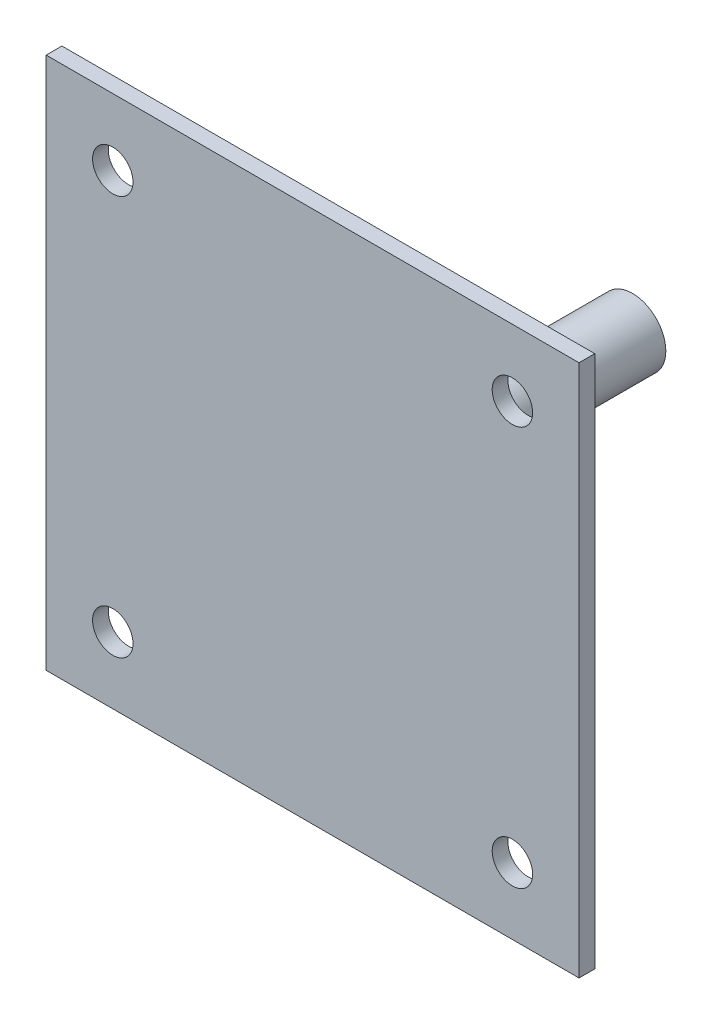
ISO-10303-21;
HEADER;
FILE_DESCRIPTION(('STEP AP214'),'2;1');
FILE_NAME('part.step','',(''),(''),'','','');
FILE_SCHEMA(('AUTOMOTIVE_DESIGN { 1 0 10303 214 1 1 1 1 }'));
ENDSEC;
DATA;
#1=APPLICATION_CONTEXT('core data for automotive mechanical design processes');
#2=APPLICATION_PROTOCOL_DEFINITION('international standard','automotive_design',2000,#1);
#3=PRODUCT_CONTEXT('',#1,'mechanical');
#4=PRODUCT('Part','Part','',(#3));
#5=PRODUCT_RELATED_PRODUCT_CATEGORY('part','',(#4));
#6=PRODUCT_DEFINITION_FORMATION('','',#4);
#7=PRODUCT_DEFINITION_CONTEXT('part definition',#1,'design');
#8=PRODUCT_DEFINITION('design','',#6,#7);
#9=PRODUCT_DEFINITION_SHAPE('','',#8);
#10=(LENGTH_UNIT() NAMED_UNIT(*) SI_UNIT(.MILLI.,.METRE.));
#11=(NAMED_UNIT(*) PLANE_ANGLE_UNIT() SI_UNIT($,.RADIAN.));
#12=(NAMED_UNIT(*) SI_UNIT($,.STERADIAN.) SOLID_ANGLE_UNIT());
#13=UNCERTAINTY_MEASURE_WITH_UNIT(LENGTH_MEASURE(1.E-05),#10,'distance_accuracy_value','');
#14=(GEOMETRIC_REPRESENTATION_CONTEXT(3) GLOBAL_UNCERTAINTY_ASSIGNED_CONTEXT((#13)) GLOBAL_UNIT_ASSIGNED_CONTEXT((#10,
#11,#12)) REPRESENTATION_CONTEXT('',''));
#15=CARTESIAN_POINT('',(0.,0.,0.));
#16=DIRECTION('',(0.,0.,1.));
#17=DIRECTION('',(1.,0.,0.));
#18=AXIS2_PLACEMENT_3D('',#15,#16,#17);
#19=CARTESIAN_POINT('',(50.8,0.,3.));
#20=DIRECTION('',(1.,0.,0.));
#21=DIRECTION('',(0.,0.,-1.));
#22=AXIS2_PLACEMENT_3D('',#19,#20,#21);
#23=PLANE('',#22);
#24=DIRECTION('',(0.,-1.,0.));
#25=VECTOR('',#24,1.);
#26=CARTESIAN_POINT('',(50.8,0.,0.));
#27=LINE('',#26,#25);
#28=CARTESIAN_POINT('',(50.8,50.8,0.));
#29=VERTEX_POINT('',#28);
#30=CARTESIAN_POINT('',(50.8,-50.8,0.));
#31=VERTEX_POINT('',#30);
#32=EDGE_CURVE('E137',#29,#31,#27,.T.);
#33=ORIENTED_EDGE('',*,*,#32,.F.);
#34=DIRECTION('',(0.,0.,-1.));
#35=VECTOR('',#34,1.);
#36=CARTESIAN_POINT('',(50.8,50.8,3.));
#37=LINE('',#36,#35);
#38=CARTESIAN_POINT('',(50.8,50.8,3.));
#39=VERTEX_POINT('',#38);
#40=EDGE_CURVE('E11',#39,#29,#37,.T.);
#41=ORIENTED_EDGE('',*,*,#40,.F.);
#42=DIRECTION('',(0.,-1.,0.));
#43=VECTOR('',#42,1.);
#44=CARTESIAN_POINT('',(50.8,0.,3.));
#45=LINE('',#44,#43);
#46=CARTESIAN_POINT('',(50.8,-50.8,3.));
#47=VERTEX_POINT('',#46);
#48=EDGE_CURVE('E110',#39,#47,#45,.T.);
#49=ORIENTED_EDGE('',*,*,#48,.T.);
#50=DIRECTION('',(0.,0.,-1.));
#51=VECTOR('',#50,1.);
#52=CARTESIAN_POINT('',(50.8,-50.8,3.));
#53=LINE('',#52,#51);
#54=EDGE_CURVE('E86',#47,#31,#53,.T.);
#55=ORIENTED_EDGE('',*,*,#54,.T.);
#56=EDGE_LOOP('',(#33,#41,#49,#55));
#57=FACE_BOUND('',#56,.T.);
#58=ADVANCED_FACE('F45',(#57),#23,.T.);
#59=CARTESIAN_POINT('',(0.,50.8,3.));
#60=DIRECTION('',(0.,1.,0.));
#61=DIRECTION('',(0.,0.,1.));
#62=AXIS2_PLACEMENT_3D('',#59,#60,#61);
#63=PLANE('',#62);
#64=DIRECTION('',(1.,0.,0.));
#65=VECTOR('',#64,1.);
#66=CARTESIAN_POINT('',(0.,50.8,0.));
#67=LINE('',#66,#65);
#68=CARTESIAN_POINT('',(-50.8,50.8,0.));
#69=VERTEX_POINT('',#68);
#70=EDGE_CURVE('E98',#69,#29,#67,.T.);
#71=ORIENTED_EDGE('',*,*,#70,.F.);
#72=DIRECTION('',(0.,0.,-1.));
#73=VECTOR('',#72,1.);
#74=CARTESIAN_POINT('',(-50.8,50.8,3.));
#75=LINE('',#74,#73);
#76=CARTESIAN_POINT('',(-50.8,50.8,3.));
#77=VERTEX_POINT('',#76);
#78=EDGE_CURVE('E55',#77,#69,#75,.T.);
#79=ORIENTED_EDGE('',*,*,#78,.F.);
#80=DIRECTION('',(1.,0.,0.));
#81=VECTOR('',#80,1.);
#82=CARTESIAN_POINT('',(0.,50.8,3.));
#83=LINE('',#82,#81);
#84=EDGE_CURVE('E96',#77,#39,#83,.T.);
#85=ORIENTED_EDGE('',*,*,#84,.T.);
#86=ORIENTED_EDGE('',*,*,#40,.T.);
#87=EDGE_LOOP('',(#71,#79,#85,#86));
#88=FACE_BOUND('',#87,.T.);
#89=ADVANCED_FACE('F94',(#88),#63,.T.);
#90=CARTESIAN_POINT('',(-50.8,0.,3.));
#91=DIRECTION('',(1.,0.,0.));
#92=DIRECTION('',(0.,0.,-1.));
#93=AXIS2_PLACEMENT_3D('',#90,#91,#92);
#94=PLANE('',#93);
#95=DIRECTION('',(0.,-1.,0.));
#96=VECTOR('',#95,1.);
#97=CARTESIAN_POINT('',(-50.8,0.,0.));
#98=LINE('',#97,#96);
#99=CARTESIAN_POINT('',(-50.8,-50.8,0.));
#100=VERTEX_POINT('',#99);
#101=EDGE_CURVE('E142',#69,#100,#98,.T.);
#102=ORIENTED_EDGE('',*,*,#101,.T.);
#103=DIRECTION('',(0.,0.,-1.));
#104=VECTOR('',#103,1.);
#105=CARTESIAN_POINT('',(-50.8,-50.8,3.));
#106=LINE('',#105,#104);
#107=CARTESIAN_POINT('',(-50.8,-50.8,3.));
#108=VERTEX_POINT('',#107);
#109=EDGE_CURVE('E102',#108,#100,#106,.T.);
#110=ORIENTED_EDGE('',*,*,#109,.F.);
#111=DIRECTION('',(0.,-1.,0.));
#112=VECTOR('',#111,1.);
#113=CARTESIAN_POINT('',(-50.8,0.,3.));
#114=LINE('',#113,#112);
#115=EDGE_CURVE('E104',#77,#108,#114,.T.);
#116=ORIENTED_EDGE('',*,*,#115,.F.);
#117=ORIENTED_EDGE('',*,*,#78,.T.);
#118=EDGE_LOOP('',(#102,#110,#116,#117));
#119=FACE_BOUND('',#118,.T.);
#120=ADVANCED_FACE('F105',(#119),#94,.F.);
#121=CARTESIAN_POINT('',(38.1,-38.1,3.));
#122=DIRECTION('',(0.,0.,-1.));
#123=DIRECTION('',(-1.,0.,0.));
#124=AXIS2_PLACEMENT_3D('',#121,#122,#123);
#125=CYLINDRICAL_SURFACE('',#124,3.85643376549096);
#126=CARTESIAN_POINT('',(38.1,-38.1,3.));
#127=DIRECTION('',(0.,0.,1.));
#128=DIRECTION('',(1.,0.,0.));
#129=AXIS2_PLACEMENT_3D('',#126,#127,#128);
#130=CIRCLE('',#129,3.85643376549096);
#131=CARTESIAN_POINT('',(41.9564337654909,-38.1,3.));
#132=VERTEX_POINT('',#131);
#133=EDGE_CURVE('E120',#132,#132,#130,.T.);
#134=ORIENTED_EDGE('',*,*,#133,.T.);
#135=EDGE_LOOP('',(#134));
#136=FACE_BOUND('',#135,.T.);
#137=CARTESIAN_POINT('',(38.1,-38.1,0.));
#138=DIRECTION('',(0.,0.,1.));
#139=DIRECTION('',(1.,0.,0.));
#140=AXIS2_PLACEMENT_3D('',#137,#138,#139);
#141=CIRCLE('',#140,3.85643376549096);
#142=CARTESIAN_POINT('',(41.9564337654909,-38.1,0.));
#143=VERTEX_POINT('',#142);
#144=EDGE_CURVE('E147',#143,#143,#141,.T.);
#145=ORIENTED_EDGE('',*,*,#144,.F.);
#146=EDGE_LOOP('',(#145));
#147=FACE_BOUND('',#146,.T.);
#148=ADVANCED_FACE('F179',(#136,#147),#125,.F.);
#149=CARTESIAN_POINT('',(0.,-50.8,3.));
#150=DIRECTION('',(0.,1.,0.));
#151=DIRECTION('',(0.,0.,1.));
#152=AXIS2_PLACEMENT_3D('',#149,#150,#151);
#153=PLANE('',#152);
#154=DIRECTION('',(1.,0.,0.));
#155=VECTOR('',#154,1.);
#156=CARTESIAN_POINT('',(0.,-50.8,0.));
#157=LINE('',#156,#155);
#158=EDGE_CURVE('E79',#100,#31,#157,.T.);
#159=ORIENTED_EDGE('',*,*,#158,.T.);
#160=ORIENTED_EDGE('',*,*,#54,.F.);
#161=DIRECTION('',(1.,0.,0.));
#162=VECTOR('',#161,1.);
#163=CARTESIAN_POINT('',(0.,-50.8,3.));
#164=LINE('',#163,#162);
#165=EDGE_CURVE('E63',#108,#47,#164,.T.);
#166=ORIENTED_EDGE('',*,*,#165,.F.);
#167=ORIENTED_EDGE('',*,*,#109,.T.);
#168=EDGE_LOOP('',(#159,#160,#166,#167));
#169=FACE_BOUND('',#168,.T.);
#170=ADVANCED_FACE('F160',(#169),#153,.F.);
#171=CARTESIAN_POINT('',(-38.1,38.1,3.));
#172=DIRECTION('',(0.,0.,-1.));
#173=DIRECTION('',(-1.,0.,0.));
#174=AXIS2_PLACEMENT_3D('',#171,#172,#173);
#175=CYLINDRICAL_SURFACE('',#174,3.85643376549096);
#176=CARTESIAN_POINT('',(-38.1,38.1,3.));
#177=DIRECTION('',(0.,0.,1.));
#178=DIRECTION('',(1.,0.,0.));
#179=AXIS2_PLACEMENT_3D('',#176,#177,#178);
#180=CIRCLE('',#179,3.85643376549096);
#181=CARTESIAN_POINT('',(-34.243566234509,38.1,3.));
#182=VERTEX_POINT('',#181);
#183=EDGE_CURVE('E114',#182,#182,#180,.T.);
#184=ORIENTED_EDGE('',*,*,#183,.T.);
#185=EDGE_LOOP('',(#184));
#186=FACE_BOUND('',#185,.T.);
#187=CARTESIAN_POINT('',(-38.1,38.1,0.));
#188=DIRECTION('',(0.,0.,1.));
#189=DIRECTION('',(1.,0.,0.));
#190=AXIS2_PLACEMENT_3D('',#187,#188,#189);
#191=CIRCLE('',#190,3.85643376549096);
#192=CARTESIAN_POINT('',(-34.243566234509,38.1,0.));
#193=VERTEX_POINT('',#192);
#194=EDGE_CURVE('E132',#193,#193,#191,.T.);
#195=ORIENTED_EDGE('',*,*,#194,.F.);
#196=EDGE_LOOP('',(#195));
#197=FACE_BOUND('',#196,.T.);
#198=ADVANCED_FACE('F170',(#186,#197),#175,.F.);
#199=CARTESIAN_POINT('',(38.1,38.1,3.));
#200=DIRECTION('',(0.,0.,-1.));
#201=DIRECTION('',(-1.,0.,0.));
#202=AXIS2_PLACEMENT_3D('',#199,#200,#201);
#203=CYLINDRICAL_SURFACE('',#202,3.85643376549096);
#204=CARTESIAN_POINT('',(38.1,38.1,3.));
#205=DIRECTION('',(0.,0.,1.));
#206=DIRECTION('',(1.,0.,0.));
#207=AXIS2_PLACEMENT_3D('',#204,#205,#206);
#208=CIRCLE('',#207,3.85643376549096);
#209=CARTESIAN_POINT('',(41.9564337654909,38.1,3.));
#210=VERTEX_POINT('',#209);
#211=EDGE_CURVE('E155',#210,#210,#208,.F.);
#212=ORIENTED_EDGE('',*,*,#211,.F.);
#213=EDGE_LOOP('',(#212));
#214=FACE_BOUND('',#213,.T.);
#215=CARTESIAN_POINT('',(38.1,38.1,0.));
#216=DIRECTION('',(0.,0.,1.));
#217=DIRECTION('',(1.,0.,0.));
#218=AXIS2_PLACEMENT_3D('',#215,#216,#217);
#219=CIRCLE('',#218,3.85643376549096);
#220=CARTESIAN_POINT('',(41.9564337654909,38.1,0.));
#221=VERTEX_POINT('',#220);
#222=EDGE_CURVE('E128',#221,#221,#219,.F.);
#223=ORIENTED_EDGE('',*,*,#222,.T.);
#224=EDGE_LOOP('',(#223));
#225=FACE_BOUND('',#224,.T.);
#226=ADVANCED_FACE('F47',(#214,#225),#203,.F.);
#227=CARTESIAN_POINT('',(-38.1,-38.1,3.));
#228=DIRECTION('',(0.,0.,-1.));
#229=DIRECTION('',(-1.,0.,0.));
#230=AXIS2_PLACEMENT_3D('',#227,#228,#229);
#231=CYLINDRICAL_SURFACE('',#230,3.85643376549096);
#232=CARTESIAN_POINT('',(-38.1,-38.1,3.));
#233=DIRECTION('',(0.,0.,1.));
#234=DIRECTION('',(1.,0.,0.));
#235=AXIS2_PLACEMENT_3D('',#232,#233,#234);
#236=CIRCLE('',#235,3.85643376549096);
#237=CARTESIAN_POINT('',(-34.243566234509,-38.1,3.));
#238=VERTEX_POINT('',#237);
#239=EDGE_CURVE('E124',#238,#238,#236,.F.);
#240=ORIENTED_EDGE('',*,*,#239,.F.);
#241=EDGE_LOOP('',(#240));
#242=FACE_BOUND('',#241,.T.);
#243=CARTESIAN_POINT('',(-38.1,-38.1,0.));
#244=DIRECTION('',(0.,0.,1.));
#245=DIRECTION('',(1.,0.,0.));
#246=AXIS2_PLACEMENT_3D('',#243,#244,#245);
#247=CIRCLE('',#246,3.85643376549096);
#248=CARTESIAN_POINT('',(-34.243566234509,-38.1,0.));
#249=VERTEX_POINT('',#248);
#250=EDGE_CURVE('E151',#249,#249,#247,.F.);
#251=ORIENTED_EDGE('',*,*,#250,.T.);
#252=EDGE_LOOP('',(#251));
#253=FACE_BOUND('',#252,.T.);
#254=ADVANCED_FACE('F177',(#242,#253),#231,.F.);
#255=CARTESIAN_POINT('',(0.,0.,3.));
#256=DIRECTION('',(0.,0.,1.));
#257=DIRECTION('',(1.,0.,0.));
#258=AXIS2_PLACEMENT_3D('',#255,#256,#257);
#259=PLANE('',#258);
#260=ORIENTED_EDGE('',*,*,#211,.T.);
#261=EDGE_LOOP('',(#260));
#262=FACE_BOUND('',#261,.T.);
#263=ORIENTED_EDGE('',*,*,#183,.F.);
#264=EDGE_LOOP('',(#263));
#265=FACE_BOUND('',#264,.T.);
#266=ORIENTED_EDGE('',*,*,#48,.F.);
#267=ORIENTED_EDGE('',*,*,#84,.F.);
#268=ORIENTED_EDGE('',*,*,#115,.T.);
#269=ORIENTED_EDGE('',*,*,#165,.T.);
#270=EDGE_LOOP('',(#266,#267,#268,#269));
#271=FACE_BOUND('',#270,.T.);
#272=ORIENTED_EDGE('',*,*,#133,.F.);
#273=EDGE_LOOP('',(#272));
#274=FACE_BOUND('',#273,.T.);
#275=ORIENTED_EDGE('',*,*,#239,.T.);
#276=EDGE_LOOP('',(#275));
#277=FACE_BOUND('',#276,.T.);
#278=ADVANCED_FACE('F108',(#262,#265,#271,#274,#277),#259,.T.);
#279=CARTESIAN_POINT('',(0.,0.,0.));
#280=DIRECTION('',(0.,0.,1.));
#281=DIRECTION('',(1.,0.,0.));
#282=AXIS2_PLACEMENT_3D('',#279,#280,#281);
#283=PLANE('',#282);
#284=CARTESIAN_POINT('',(0.,0.,0.));
#285=DIRECTION('',(0.,0.,1.));
#286=DIRECTION('',(1.,0.,0.));
#287=AXIS2_PLACEMENT_3D('',#284,#285,#286);
#288=CIRCLE('',#287,6.35);
#289=CARTESIAN_POINT('',(6.34999999999999,0.,0.));
#290=VERTEX_POINT('',#289);
#291=EDGE_CURVE('E304',#290,#290,#288,.T.);
#292=ORIENTED_EDGE('',*,*,#291,.T.);
#293=EDGE_LOOP('',(#292));
#294=FACE_BOUND('',#293,.T.);
#295=ORIENTED_EDGE('',*,*,#222,.F.);
#296=EDGE_LOOP('',(#295));
#297=FACE_BOUND('',#296,.T.);
#298=ORIENTED_EDGE('',*,*,#194,.T.);
#299=EDGE_LOOP('',(#298));
#300=FACE_BOUND('',#299,.T.);
#301=ORIENTED_EDGE('',*,*,#32,.T.);
#302=ORIENTED_EDGE('',*,*,#158,.F.);
#303=ORIENTED_EDGE('',*,*,#101,.F.);
#304=ORIENTED_EDGE('',*,*,#70,.T.);
#305=EDGE_LOOP('',(#301,#302,#303,#304));
#306=FACE_BOUND('',#305,.T.);
#307=ORIENTED_EDGE('',*,*,#144,.T.);
#308=EDGE_LOOP('',(#307));
#309=FACE_BOUND('',#308,.T.);
#310=ORIENTED_EDGE('',*,*,#250,.F.);
#311=EDGE_LOOP('',(#310));
#312=FACE_BOUND('',#311,.T.);
#313=ADVANCED_FACE('F161',(#294,#297,#300,#306,#309,#312),#283,.F.);
#314=CARTESIAN_POINT('',(0.,0.,-58.));
#315=DIRECTION('',(0.,0.,1.));
#316=DIRECTION('',(1.,0.,0.));
#317=AXIS2_PLACEMENT_3D('',#314,#315,#316);
#318=CYLINDRICAL_SURFACE('',#317,6.35);
#319=CARTESIAN_POINT('',(0.,0.,-58.));
#320=DIRECTION('',(0.,0.,1.));
#321=DIRECTION('',(1.,0.,0.));
#322=AXIS2_PLACEMENT_3D('',#319,#320,#321);
#323=CIRCLE('',#322,6.35);
#324=CARTESIAN_POINT('',(6.34999999999999,0.,-58.));
#325=VERTEX_POINT('',#324);
#326=EDGE_CURVE('E133',#325,#325,#323,.T.);
#327=CARTESIAN_POINT('',(6.34999999999999,0.,-58.));
#328=CARTESIAN_POINT('',(6.34999999999999,0.,-57.3958333333333));
#329=CARTESIAN_POINT('',(6.34999999999999,0.,-56.7916666666667));
#330=CARTESIAN_POINT('',(6.34999999999999,0.,-55.5833333333333));
#331=CARTESIAN_POINT('',(6.34999999999999,0.,-54.9791666666667));
#332=CARTESIAN_POINT('',(6.34999999999999,0.,-53.7708333333333));
#333=CARTESIAN_POINT('',(6.34999999999999,0.,-53.1666666666667));
#334=CARTESIAN_POINT('',(6.34999999999999,0.,-51.9583333333333));
#335=CARTESIAN_POINT('',(6.34999999999999,0.,-51.3541666666667));
#336=CARTESIAN_POINT('',(6.34999999999999,0.,-50.1458333333333));
#337=CARTESIAN_POINT('',(6.34999999999999,0.,-49.5416666666667));
#338=CARTESIAN_POINT('',(6.34999999999999,0.,-48.3333333333333));
#339=CARTESIAN_POINT('',(6.34999999999999,0.,-47.7291666666667));
#340=CARTESIAN_POINT('',(6.34999999999999,0.,-46.5208333333333));
#341=CARTESIAN_POINT('',(6.34999999999999,0.,-45.9166666666667));
#342=CARTESIAN_POINT('',(6.34999999999999,0.,-44.7083333333333));
#343=CARTESIAN_POINT('',(6.34999999999999,0.,-44.1041666666667));
#344=CARTESIAN_POINT('',(6.34999999999999,0.,-42.8958333333333));
#345=CARTESIAN_POINT('',(6.34999999999999,0.,-42.2916666666667));
#346=CARTESIAN_POINT('',(6.34999999999999,0.,-41.0833333333333));
#347=CARTESIAN_POINT('',(6.34999999999999,0.,-40.4791666666667));
#348=CARTESIAN_POINT('',(6.34999999999999,0.,-39.2708333333333));
#349=CARTESIAN_POINT('',(6.34999999999999,0.,-38.6666666666667));
#350=CARTESIAN_POINT('',(6.34999999999999,0.,-37.4583333333333));
#351=CARTESIAN_POINT('',(6.34999999999999,0.,-36.8541666666667));
#352=CARTESIAN_POINT('',(6.34999999999999,0.,-35.6458333333333));
#353=CARTESIAN_POINT('',(6.34999999999999,0.,-35.0416666666667));
#354=CARTESIAN_POINT('',(6.34999999999999,0.,-33.8333333333333));
#355=CARTESIAN_POINT('',(6.34999999999999,0.,-33.2291666666667));
#356=CARTESIAN_POINT('',(6.34999999999999,0.,-32.0208333333333));
#357=CARTESIAN_POINT('',(6.34999999999999,0.,-31.4166666666667));
#358=CARTESIAN_POINT('',(6.34999999999999,0.,-30.2083333333333));
#359=CARTESIAN_POINT('',(6.34999999999999,0.,-29.6041666666667));
#360=CARTESIAN_POINT('',(6.34999999999999,0.,-28.3958333333333));
#361=CARTESIAN_POINT('',(6.34999999999999,0.,-27.7916666666667));
#362=CARTESIAN_POINT('',(6.34999999999999,0.,-26.5833333333333));
#363=CARTESIAN_POINT('',(6.34999999999999,0.,-25.9791666666667));
#364=CARTESIAN_POINT('',(6.34999999999999,0.,-24.7708333333333));
#365=CARTESIAN_POINT('',(6.34999999999999,0.,-24.1666666666667));
#366=CARTESIAN_POINT('',(6.34999999999999,0.,-22.9583333333333));
#367=CARTESIAN_POINT('',(6.34999999999999,0.,-22.3541666666667));
#368=CARTESIAN_POINT('',(6.34999999999999,0.,-21.1458333333333));
#369=CARTESIAN_POINT('',(6.34999999999999,0.,-20.5416666666667));
#370=CARTESIAN_POINT('',(6.34999999999999,0.,-19.3333333333333));
#371=CARTESIAN_POINT('',(6.34999999999999,0.,-18.7291666666667));
#372=CARTESIAN_POINT('',(6.34999999999999,0.,-17.5208333333333));
#373=CARTESIAN_POINT('',(6.34999999999999,0.,-16.9166666666667));
#374=CARTESIAN_POINT('',(6.34999999999999,0.,-15.7083333333333));
#375=CARTESIAN_POINT('',(6.34999999999999,0.,-15.1041666666667));
#376=CARTESIAN_POINT('',(6.34999999999999,0.,-13.8958333333333));
#377=CARTESIAN_POINT('',(6.34999999999999,0.,-13.2916666666667));
#378=CARTESIAN_POINT('',(6.34999999999999,0.,-12.0833333333333));
#379=CARTESIAN_POINT('',(6.34999999999999,0.,-11.4791666666667));
#380=CARTESIAN_POINT('',(6.34999999999999,0.,-10.2708333333333));
#381=CARTESIAN_POINT('',(6.34999999999999,0.,-9.66666666666667));
#382=CARTESIAN_POINT('',(6.34999999999999,0.,-8.45833333333333));
#383=CARTESIAN_POINT('',(6.34999999999999,0.,-7.85416666666667));
#384=CARTESIAN_POINT('',(6.34999999999999,0.,-6.64583333333333));
#385=CARTESIAN_POINT('',(6.34999999999999,0.,-6.04166666666667));
#386=CARTESIAN_POINT('',(6.34999999999999,0.,-4.83333333333333));
#387=CARTESIAN_POINT('',(6.34999999999999,0.,-4.22916666666667));
#388=CARTESIAN_POINT('',(6.34999999999999,0.,-3.02083333333334));
#389=CARTESIAN_POINT('',(6.34999999999999,0.,-2.41666666666667));
#390=CARTESIAN_POINT('',(6.34999999999999,0.,-1.20833333333333));
#391=CARTESIAN_POINT('',(6.34999999999999,0.,-0.604166666666666));
#392=CARTESIAN_POINT('',(6.34999999999999,0.,0.));
#393=B_SPLINE_CURVE_WITH_KNOTS('',3,(#327,#328,#329,#330,#331,#332,#333,#334,#335,#336,#337,
#338,#339,#340,#341,#342,#343,#344,#345,#346,#347,#348,#349,#350,#351,#352,#353,#354,#355,#356,
#357,#358,#359,#360,#361,#362,#363,#364,#365,#366,#367,#368,#369,#370,#371,#372,#373,#374,#375,
#376,#377,#378,#379,#380,#381,#382,#383,#384,#385,#386,#387,#388,#389,#390,#391,#392),
.UNSPECIFIED.,.F.,.F.,(4,2,2,2,2,2,2,2,2,2,2,2,2,2,2,2,2,2,2,2,2,2,2,2,2,2,2,2,2,2,2,2,4),(0.,
1.81249999999999,3.625,5.4375,7.25,9.06249999999999,10.875,12.6875,14.5,16.3125,18.125,19.9375,
21.75,23.5625,25.375,27.1875,29.,30.8125,32.625,34.4375,36.25,38.0625,39.875,41.6875,43.5,
45.3125,47.125,48.9375,50.75,52.5625,54.375,56.1875,58.),.UNSPECIFIED.);
#394=EDGE_CURVE('BSEAM187',#325,#290,#393,.T.);
#395=ORIENTED_EDGE('',*,*,#326,.T.);
#396=ORIENTED_EDGE('',*,*,#291,.F.);
#397=ORIENTED_EDGE('',*,*,#394,.T.);
#398=ORIENTED_EDGE('',*,*,#394,.F.);
#399=EDGE_LOOP('',(#395,#397,#396,#398));
#400=FACE_BOUND('',#399,.T.);
#401=ADVANCED_FACE('F187',(#400),#318,.T.);
#402=CARTESIAN_POINT('',(0.,0.,-58.));
#403=DIRECTION('',(0.,0.,1.));
#404=DIRECTION('',(1.,0.,0.));
#405=AXIS2_PLACEMENT_3D('',#402,#403,#404);
#406=PLANE('',#405);
#407=ORIENTED_EDGE('',*,*,#326,.F.);
#408=EDGE_LOOP('',(#407));
#409=FACE_BOUND('',#408,.T.);
#410=ADVANCED_FACE('F194',(#409),#406,.F.);
#411=CLOSED_SHELL('',(#58,#89,#120,#148,#170,#198,#226,#254,#278,#313,#401,#410));
#412=MANIFOLD_SOLID_BREP('B2',#411);
#413=ADVANCED_BREP_SHAPE_REPRESENTATION('',(#18,#412),#14);
#414=SHAPE_DEFINITION_REPRESENTATION(#9,#413);
ENDSEC;
END-ISO-10303-21;
